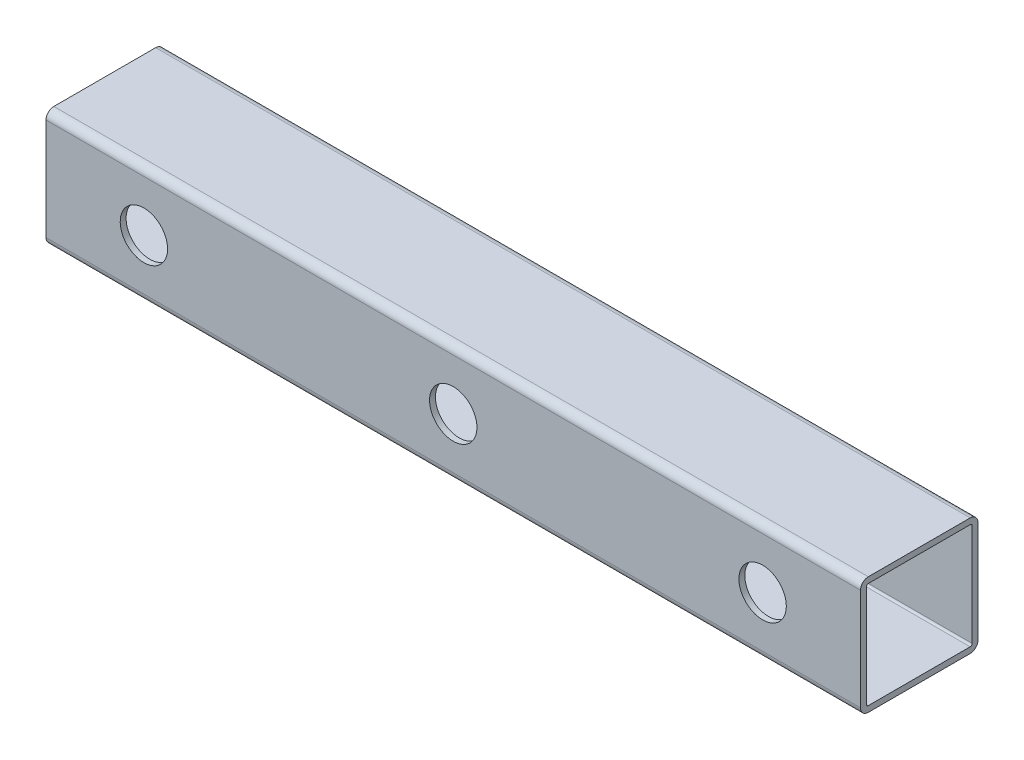
ISO-10303-21;
HEADER;
FILE_DESCRIPTION(('STEP AP214'),'2;1');
FILE_NAME('part.step','',(''),(''),'','','');
FILE_SCHEMA(('AUTOMOTIVE_DESIGN { 1 0 10303 214 1 1 1 1 }'));
ENDSEC;
DATA;
#1=APPLICATION_CONTEXT('core data for automotive mechanical design processes');
#2=APPLICATION_PROTOCOL_DEFINITION('international standard','automotive_design',2000,#1);
#3=PRODUCT_CONTEXT('',#1,'mechanical');
#4=PRODUCT('Part','Part','',(#3));
#5=PRODUCT_RELATED_PRODUCT_CATEGORY('part','',(#4));
#6=PRODUCT_DEFINITION_FORMATION('','',#4);
#7=PRODUCT_DEFINITION_CONTEXT('part definition',#1,'design');
#8=PRODUCT_DEFINITION('design','',#6,#7);
#9=PRODUCT_DEFINITION_SHAPE('','',#8);
#10=(LENGTH_UNIT() NAMED_UNIT(*) SI_UNIT(.MILLI.,.METRE.));
#11=(NAMED_UNIT(*) PLANE_ANGLE_UNIT() SI_UNIT($,.RADIAN.));
#12=(NAMED_UNIT(*) SI_UNIT($,.STERADIAN.) SOLID_ANGLE_UNIT());
#13=UNCERTAINTY_MEASURE_WITH_UNIT(LENGTH_MEASURE(1.E-05),#10,'distance_accuracy_value','');
#14=(GEOMETRIC_REPRESENTATION_CONTEXT(3) GLOBAL_UNCERTAINTY_ASSIGNED_CONTEXT((#13)) GLOBAL_UNIT_ASSIGNED_CONTEXT((#10,
#11,#12)) REPRESENTATION_CONTEXT('',''));
#15=CARTESIAN_POINT('',(0.,0.,0.));
#16=DIRECTION('',(0.,0.,1.));
#17=DIRECTION('',(1.,0.,0.));
#18=AXIS2_PLACEMENT_3D('',#15,#16,#17);
#19=CARTESIAN_POINT('',(208.,-30.,26.));
#20=DIRECTION('',(0.,1.,0.));
#21=DIRECTION('',(0.,0.,1.));
#22=AXIS2_PLACEMENT_3D('',#19,#20,#21);
#23=PLANE('',#22);
#24=DIRECTION('',(0.,0.,1.));
#25=VECTOR('',#24,1.);
#26=CARTESIAN_POINT('',(152.,-30.,26.));
#27=LINE('',#26,#25);
#28=CARTESIAN_POINT('',(152.,-30.,-26.));
#29=VERTEX_POINT('',#28);
#30=CARTESIAN_POINT('',(152.,-30.,26.));
#31=VERTEX_POINT('',#30);
#32=EDGE_CURVE('E11',#29,#31,#27,.T.);
#33=ORIENTED_EDGE('',*,*,#32,.F.);
#34=DIRECTION('',(-1.,0.,0.));
#35=VECTOR('',#34,1.);
#36=CARTESIAN_POINT('',(208.,-30.,-26.));
#37=LINE('',#36,#35);
#38=CARTESIAN_POINT('',(208.,-30.,-26.));
#39=VERTEX_POINT('',#38);
#40=EDGE_CURVE('E298',#39,#29,#37,.T.);
#41=ORIENTED_EDGE('',*,*,#40,.F.);
#42=DIRECTION('',(0.,0.,-1.));
#43=VECTOR('',#42,1.);
#44=CARTESIAN_POINT('',(208.,-30.,26.));
#45=LINE('',#44,#43);
#46=CARTESIAN_POINT('',(208.,-30.,26.));
#47=VERTEX_POINT('',#46);
#48=EDGE_CURVE('E248',#47,#39,#45,.T.);
#49=ORIENTED_EDGE('',*,*,#48,.F.);
#50=DIRECTION('',(-1.,0.,0.));
#51=VECTOR('',#50,1.);
#52=CARTESIAN_POINT('',(208.,-30.,26.));
#53=LINE('',#52,#51);
#54=EDGE_CURVE('E303',#47,#31,#53,.T.);
#55=ORIENTED_EDGE('',*,*,#54,.T.);
#56=EDGE_LOOP('',(#33,#41,#49,#55));
#57=FACE_BOUND('',#56,.T.);
#58=ADVANCED_FACE('F45',(#57),#23,.F.);
#59=DIRECTION('',(0.,0.,-1.));
#60=VECTOR('',#59,1.);
#61=CARTESIAN_POINT('',(-152.,-30.,26.));
#62=LINE('',#61,#60);
#63=CARTESIAN_POINT('',(-152.,-30.,26.));
#64=VERTEX_POINT('',#63);
#65=CARTESIAN_POINT('',(-152.,-30.,-26.));
#66=VERTEX_POINT('',#65);
#67=EDGE_CURVE('E55',#64,#66,#62,.T.);
#68=ORIENTED_EDGE('',*,*,#67,.F.);
#69=CARTESIAN_POINT('',(-208.,-30.,26.));
#70=VERTEX_POINT('',#69);
#71=EDGE_CURVE('E301',#64,#70,#53,.T.);
#72=ORIENTED_EDGE('',*,*,#71,.T.);
#73=DIRECTION('',(0.,0.,-1.));
#74=VECTOR('',#73,1.);
#75=CARTESIAN_POINT('',(-208.,-30.,26.));
#76=LINE('',#75,#74);
#77=CARTESIAN_POINT('',(-208.,-30.,-26.));
#78=VERTEX_POINT('',#77);
#79=EDGE_CURVE('E266',#70,#78,#76,.T.);
#80=ORIENTED_EDGE('',*,*,#79,.T.);
#81=EDGE_CURVE('E297',#66,#78,#37,.T.);
#82=ORIENTED_EDGE('',*,*,#81,.F.);
#83=EDGE_LOOP('',(#68,#72,#80,#82));
#84=FACE_BOUND('',#83,.T.);
#85=ADVANCED_FACE('F376',(#84),#23,.F.);
#86=CARTESIAN_POINT('',(208.,-26.,26.));
#87=DIRECTION('',(-1.,0.,0.));
#88=DIRECTION('',(0.,0.,1.));
#89=AXIS2_PLACEMENT_3D('',#86,#87,#88);
#90=PLANE('',#89);
#91=CARTESIAN_POINT('',(208.,-26.,26.));
#92=DIRECTION('',(1.,0.,0.));
#93=DIRECTION('',(0.,0.,1.));
#94=AXIS2_PLACEMENT_3D('',#91,#92,#93);
#95=CIRCLE('',#94,4.);
#96=CARTESIAN_POINT('',(208.,-26.,30.));
#97=VERTEX_POINT('',#96);
#98=EDGE_CURVE('E245',#97,#47,#95,.T.);
#99=ORIENTED_EDGE('',*,*,#98,.T.);
#100=ORIENTED_EDGE('',*,*,#48,.T.);
#101=CARTESIAN_POINT('',(208.,-26.,-26.));
#102=DIRECTION('',(1.,0.,0.));
#103=DIRECTION('',(0.,0.,-1.));
#104=AXIS2_PLACEMENT_3D('',#101,#102,#103);
#105=CIRCLE('',#104,4.00000000000001);
#106=CARTESIAN_POINT('',(208.,-26.,-30.));
#107=VERTEX_POINT('',#106);
#108=EDGE_CURVE('E251',#39,#107,#105,.T.);
#109=ORIENTED_EDGE('',*,*,#108,.T.);
#110=DIRECTION('',(0.,1.,0.));
#111=VECTOR('',#110,1.);
#112=CARTESIAN_POINT('',(208.,-26.,-30.));
#113=LINE('',#112,#111);
#114=CARTESIAN_POINT('',(208.,26.,-30.));
#115=VERTEX_POINT('',#114);
#116=EDGE_CURVE('E253',#107,#115,#113,.T.);
#117=ORIENTED_EDGE('',*,*,#116,.T.);
#118=CARTESIAN_POINT('',(208.,26.,-26.));
#119=DIRECTION('',(1.,0.,0.));
#120=DIRECTION('',(0.,0.,1.));
#121=AXIS2_PLACEMENT_3D('',#118,#119,#120);
#122=CIRCLE('',#121,4.);
#123=CARTESIAN_POINT('',(208.,30.,-26.));
#124=VERTEX_POINT('',#123);
#125=EDGE_CURVE('E255',#115,#124,#122,.T.);
#126=ORIENTED_EDGE('',*,*,#125,.T.);
#127=DIRECTION('',(0.,0.,1.));
#128=VECTOR('',#127,1.);
#129=CARTESIAN_POINT('',(208.,30.,26.));
#130=LINE('',#129,#128);
#131=CARTESIAN_POINT('',(208.,30.,26.));
#132=VERTEX_POINT('',#131);
#133=EDGE_CURVE('E257',#124,#132,#130,.T.);
#134=ORIENTED_EDGE('',*,*,#133,.T.);
#135=CARTESIAN_POINT('',(208.,26.,26.));
#136=DIRECTION('',(1.,0.,0.));
#137=DIRECTION('',(0.,0.,1.));
#138=AXIS2_PLACEMENT_3D('',#135,#136,#137);
#139=CIRCLE('',#138,4.);
#140=CARTESIAN_POINT('',(208.,26.,30.));
#141=VERTEX_POINT('',#140);
#142=EDGE_CURVE('E259',#132,#141,#139,.T.);
#143=ORIENTED_EDGE('',*,*,#142,.T.);
#144=DIRECTION('',(0.,-1.,0.));
#145=VECTOR('',#144,1.);
#146=CARTESIAN_POINT('',(208.,-26.,30.));
#147=LINE('',#146,#145);
#148=EDGE_CURVE('E261',#141,#97,#147,.T.);
#149=ORIENTED_EDGE('',*,*,#148,.T.);
#150=EDGE_LOOP('',(#99,#100,#109,#117,#126,#134,#143,#149));
#151=FACE_BOUND('',#150,.T.);
#152=CARTESIAN_POINT('',(208.,26.,26.));
#153=DIRECTION('',(1.,0.,0.));
#154=DIRECTION('',(0.,0.,1.));
#155=AXIS2_PLACEMENT_3D('',#152,#153,#154);
#156=CIRCLE('',#155,1.);
#157=CARTESIAN_POINT('',(208.,27.,26.));
#158=VERTEX_POINT('',#157);
#159=CARTESIAN_POINT('',(208.,26.,27.));
#160=VERTEX_POINT('',#159);
#161=EDGE_CURVE('E172',#158,#160,#156,.T.);
#162=ORIENTED_EDGE('',*,*,#161,.F.);
#163=DIRECTION('',(0.,0.,1.));
#164=VECTOR('',#163,1.);
#165=CARTESIAN_POINT('',(208.,27.,26.));
#166=LINE('',#165,#164);
#167=CARTESIAN_POINT('',(208.,27.,-26.));
#168=VERTEX_POINT('',#167);
#169=EDGE_CURVE('E210',#168,#158,#166,.T.);
#170=ORIENTED_EDGE('',*,*,#169,.F.);
#171=CARTESIAN_POINT('',(208.,26.,-26.));
#172=DIRECTION('',(1.,0.,0.));
#173=DIRECTION('',(0.,0.,1.));
#174=AXIS2_PLACEMENT_3D('',#171,#172,#173);
#175=CIRCLE('',#174,1.);
#176=CARTESIAN_POINT('',(208.,26.,-27.));
#177=VERTEX_POINT('',#176);
#178=EDGE_CURVE('E207',#177,#168,#175,.T.);
#179=ORIENTED_EDGE('',*,*,#178,.F.);
#180=DIRECTION('',(0.,1.,0.));
#181=VECTOR('',#180,1.);
#182=CARTESIAN_POINT('',(208.,-26.,-27.));
#183=LINE('',#182,#181);
#184=CARTESIAN_POINT('',(208.,-26.,-27.));
#185=VERTEX_POINT('',#184);
#186=EDGE_CURVE('E205',#185,#177,#183,.T.);
#187=ORIENTED_EDGE('',*,*,#186,.F.);
#188=CARTESIAN_POINT('',(208.,-26.,-26.));
#189=DIRECTION('',(1.,0.,0.));
#190=DIRECTION('',(0.,0.,-1.));
#191=AXIS2_PLACEMENT_3D('',#188,#189,#190);
#192=CIRCLE('',#191,1.00000000000001);
#193=CARTESIAN_POINT('',(208.,-27.,-26.));
#194=VERTEX_POINT('',#193);
#195=EDGE_CURVE('E203',#194,#185,#192,.T.);
#196=ORIENTED_EDGE('',*,*,#195,.F.);
#197=DIRECTION('',(0.,0.,-1.));
#198=VECTOR('',#197,1.);
#199=CARTESIAN_POINT('',(208.,-27.,26.));
#200=LINE('',#199,#198);
#201=CARTESIAN_POINT('',(208.,-27.,26.));
#202=VERTEX_POINT('',#201);
#203=EDGE_CURVE('E198',#202,#194,#200,.T.);
#204=ORIENTED_EDGE('',*,*,#203,.F.);
#205=CARTESIAN_POINT('',(208.,-26.,26.));
#206=DIRECTION('',(1.,0.,0.));
#207=DIRECTION('',(0.,0.,1.));
#208=AXIS2_PLACEMENT_3D('',#205,#206,#207);
#209=CIRCLE('',#208,1.);
#210=CARTESIAN_POINT('',(208.,-26.,27.));
#211=VERTEX_POINT('',#210);
#212=EDGE_CURVE('E196',#211,#202,#209,.T.);
#213=ORIENTED_EDGE('',*,*,#212,.F.);
#214=DIRECTION('',(0.,-1.,0.));
#215=VECTOR('',#214,1.);
#216=CARTESIAN_POINT('',(208.,-26.,27.));
#217=LINE('',#216,#215);
#218=EDGE_CURVE('E182',#160,#211,#217,.T.);
#219=ORIENTED_EDGE('',*,*,#218,.F.);
#220=EDGE_LOOP('',(#162,#170,#179,#187,#196,#204,#213,#219));
#221=FACE_BOUND('',#220,.T.);
#222=ADVANCED_FACE('F194',(#151,#221),#90,.F.);
#223=CARTESIAN_POINT('',(-208.,-26.,26.));
#224=DIRECTION('',(-1.,0.,0.));
#225=DIRECTION('',(0.,0.,1.));
#226=AXIS2_PLACEMENT_3D('',#223,#224,#225);
#227=PLANE('',#226);
#228=CARTESIAN_POINT('',(-208.,-26.,26.));
#229=DIRECTION('',(1.,0.,0.));
#230=DIRECTION('',(0.,0.,1.));
#231=AXIS2_PLACEMENT_3D('',#228,#229,#230);
#232=CIRCLE('',#231,4.);
#233=CARTESIAN_POINT('',(-208.,-26.,30.));
#234=VERTEX_POINT('',#233);
#235=EDGE_CURVE('E190',#234,#70,#232,.T.);
#236=ORIENTED_EDGE('',*,*,#235,.F.);
#237=DIRECTION('',(0.,-1.,0.));
#238=VECTOR('',#237,1.);
#239=CARTESIAN_POINT('',(-208.,-26.,30.));
#240=LINE('',#239,#238);
#241=CARTESIAN_POINT('',(-208.,26.,30.));
#242=VERTEX_POINT('',#241);
#243=EDGE_CURVE('E249',#242,#234,#240,.T.);
#244=ORIENTED_EDGE('',*,*,#243,.F.);
#245=CARTESIAN_POINT('',(-208.,26.,26.));
#246=DIRECTION('',(1.,0.,0.));
#247=DIRECTION('',(0.,0.,1.));
#248=AXIS2_PLACEMENT_3D('',#245,#246,#247);
#249=CIRCLE('',#248,4.);
#250=CARTESIAN_POINT('',(-208.,30.,26.));
#251=VERTEX_POINT('',#250);
#252=EDGE_CURVE('E277',#251,#242,#249,.T.);
#253=ORIENTED_EDGE('',*,*,#252,.F.);
#254=DIRECTION('',(0.,0.,1.));
#255=VECTOR('',#254,1.);
#256=CARTESIAN_POINT('',(-208.,30.,26.));
#257=LINE('',#256,#255);
#258=CARTESIAN_POINT('',(-208.,30.,-26.));
#259=VERTEX_POINT('',#258);
#260=EDGE_CURVE('E275',#259,#251,#257,.T.);
#261=ORIENTED_EDGE('',*,*,#260,.F.);
#262=CARTESIAN_POINT('',(-208.,26.,-26.));
#263=DIRECTION('',(1.,0.,0.));
#264=DIRECTION('',(0.,0.,1.));
#265=AXIS2_PLACEMENT_3D('',#262,#263,#264);
#266=CIRCLE('',#265,4.);
#267=CARTESIAN_POINT('',(-208.,26.,-30.));
#268=VERTEX_POINT('',#267);
#269=EDGE_CURVE('E273',#268,#259,#266,.T.);
#270=ORIENTED_EDGE('',*,*,#269,.F.);
#271=DIRECTION('',(0.,1.,0.));
#272=VECTOR('',#271,1.);
#273=CARTESIAN_POINT('',(-208.,-26.,-30.));
#274=LINE('',#273,#272);
#275=CARTESIAN_POINT('',(-208.,-26.,-30.));
#276=VERTEX_POINT('',#275);
#277=EDGE_CURVE('E271',#276,#268,#274,.T.);
#278=ORIENTED_EDGE('',*,*,#277,.F.);
#279=CARTESIAN_POINT('',(-208.,-26.,-26.));
#280=DIRECTION('',(1.,0.,0.));
#281=DIRECTION('',(0.,0.,-1.));
#282=AXIS2_PLACEMENT_3D('',#279,#280,#281);
#283=CIRCLE('',#282,4.00000000000001);
#284=EDGE_CURVE('E269',#78,#276,#283,.T.);
#285=ORIENTED_EDGE('',*,*,#284,.F.);
#286=ORIENTED_EDGE('',*,*,#79,.F.);
#287=EDGE_LOOP('',(#236,#244,#253,#261,#270,#278,#285,#286));
#288=FACE_BOUND('',#287,.T.);
#289=DIRECTION('',(0.,0.,1.));
#290=VECTOR('',#289,1.);
#291=CARTESIAN_POINT('',(-208.,27.,26.));
#292=LINE('',#291,#290);
#293=CARTESIAN_POINT('',(-208.,27.,-26.));
#294=VERTEX_POINT('',#293);
#295=CARTESIAN_POINT('',(-208.,27.,26.));
#296=VERTEX_POINT('',#295);
#297=EDGE_CURVE('E183',#294,#296,#292,.T.);
#298=ORIENTED_EDGE('',*,*,#297,.T.);
#299=CARTESIAN_POINT('',(-208.,26.,26.));
#300=DIRECTION('',(1.,0.,0.));
#301=DIRECTION('',(0.,0.,1.));
#302=AXIS2_PLACEMENT_3D('',#299,#300,#301);
#303=CIRCLE('',#302,1.);
#304=CARTESIAN_POINT('',(-208.,26.,27.));
#305=VERTEX_POINT('',#304);
#306=EDGE_CURVE('E212',#296,#305,#303,.T.);
#307=ORIENTED_EDGE('',*,*,#306,.T.);
#308=DIRECTION('',(0.,-1.,0.));
#309=VECTOR('',#308,1.);
#310=CARTESIAN_POINT('',(-208.,-26.,27.));
#311=LINE('',#310,#309);
#312=CARTESIAN_POINT('',(-208.,-26.,27.));
#313=VERTEX_POINT('',#312);
#314=EDGE_CURVE('E189',#305,#313,#311,.T.);
#315=ORIENTED_EDGE('',*,*,#314,.T.);
#316=CARTESIAN_POINT('',(-208.,-26.,26.));
#317=DIRECTION('',(1.,0.,0.));
#318=DIRECTION('',(0.,0.,1.));
#319=AXIS2_PLACEMENT_3D('',#316,#317,#318);
#320=CIRCLE('',#319,1.);
#321=CARTESIAN_POINT('',(-208.,-27.,26.));
#322=VERTEX_POINT('',#321);
#323=EDGE_CURVE('E216',#313,#322,#320,.T.);
#324=ORIENTED_EDGE('',*,*,#323,.T.);
#325=DIRECTION('',(0.,0.,-1.));
#326=VECTOR('',#325,1.);
#327=CARTESIAN_POINT('',(-208.,-27.,26.));
#328=LINE('',#327,#326);
#329=CARTESIAN_POINT('',(-208.,-27.,-26.));
#330=VERTEX_POINT('',#329);
#331=EDGE_CURVE('E219',#322,#330,#328,.T.);
#332=ORIENTED_EDGE('',*,*,#331,.T.);
#333=CARTESIAN_POINT('',(-208.,-26.,-26.));
#334=DIRECTION('',(1.,0.,0.));
#335=DIRECTION('',(0.,0.,-1.));
#336=AXIS2_PLACEMENT_3D('',#333,#334,#335);
#337=CIRCLE('',#336,1.00000000000001);
#338=CARTESIAN_POINT('',(-208.,-26.,-27.));
#339=VERTEX_POINT('',#338);
#340=EDGE_CURVE('E222',#330,#339,#337,.T.);
#341=ORIENTED_EDGE('',*,*,#340,.T.);
#342=DIRECTION('',(0.,1.,0.));
#343=VECTOR('',#342,1.);
#344=CARTESIAN_POINT('',(-208.,-26.,-27.));
#345=LINE('',#344,#343);
#346=CARTESIAN_POINT('',(-208.,26.,-27.));
#347=VERTEX_POINT('',#346);
#348=EDGE_CURVE('E225',#339,#347,#345,.T.);
#349=ORIENTED_EDGE('',*,*,#348,.T.);
#350=CARTESIAN_POINT('',(-208.,26.,-26.));
#351=DIRECTION('',(1.,0.,0.));
#352=DIRECTION('',(0.,0.,1.));
#353=AXIS2_PLACEMENT_3D('',#350,#351,#352);
#354=CIRCLE('',#353,1.);
#355=EDGE_CURVE('E228',#347,#294,#354,.T.);
#356=ORIENTED_EDGE('',*,*,#355,.T.);
#357=EDGE_LOOP('',(#298,#307,#315,#324,#332,#341,#349,#356));
#358=FACE_BOUND('',#357,.T.);
#359=ADVANCED_FACE('F352',(#288,#358),#227,.T.);
#360=CARTESIAN_POINT('',(208.,-26.,26.));
#361=DIRECTION('',(-1.,0.,0.));
#362=DIRECTION('',(0.,0.,1.));
#363=AXIS2_PLACEMENT_3D('',#360,#361,#362);
#364=CYLINDRICAL_SURFACE('',#363,4.);
#365=ORIENTED_EDGE('',*,*,#235,.T.);
#366=ORIENTED_EDGE('',*,*,#71,.F.);
#367=EDGE_CURVE('E306',#31,#64,#53,.T.);
#368=ORIENTED_EDGE('',*,*,#367,.F.);
#369=ORIENTED_EDGE('',*,*,#54,.F.);
#370=ORIENTED_EDGE('',*,*,#98,.F.);
#371=DIRECTION('',(-1.,0.,0.));
#372=VECTOR('',#371,1.);
#373=CARTESIAN_POINT('',(208.,-26.,30.));
#374=LINE('',#373,#372);
#375=EDGE_CURVE('E263',#97,#234,#374,.T.);
#376=ORIENTED_EDGE('',*,*,#375,.T.);
#377=EDGE_LOOP('',(#365,#366,#368,#369,#370,#376));
#378=FACE_BOUND('',#377,.T.);
#379=ADVANCED_FACE('F47',(#378),#364,.T.);
#380=EDGE_CURVE('E302',#29,#66,#37,.T.);
#381=ORIENTED_EDGE('',*,*,#380,.F.);
#382=ORIENTED_EDGE('',*,*,#32,.T.);
#383=ORIENTED_EDGE('',*,*,#367,.T.);
#384=ORIENTED_EDGE('',*,*,#67,.T.);
#385=EDGE_LOOP('',(#381,#382,#383,#384));
#386=FACE_BOUND('',#385,.T.);
#387=ADVANCED_FACE('F378',(#386),#23,.F.);
#388=CARTESIAN_POINT('',(208.,-26.,-26.));
#389=DIRECTION('',(-1.,0.,0.));
#390=DIRECTION('',(0.,0.,1.));
#391=AXIS2_PLACEMENT_3D('',#388,#389,#390);
#392=CYLINDRICAL_SURFACE('',#391,4.00000000000001);
#393=ORIENTED_EDGE('',*,*,#284,.T.);
#394=DIRECTION('',(-1.,0.,0.));
#395=VECTOR('',#394,1.);
#396=CARTESIAN_POINT('',(208.,-26.,-30.));
#397=LINE('',#396,#395);
#398=EDGE_CURVE('E294',#107,#276,#397,.T.);
#399=ORIENTED_EDGE('',*,*,#398,.F.);
#400=ORIENTED_EDGE('',*,*,#108,.F.);
#401=ORIENTED_EDGE('',*,*,#40,.T.);
#402=ORIENTED_EDGE('',*,*,#380,.T.);
#403=ORIENTED_EDGE('',*,*,#81,.T.);
#404=EDGE_LOOP('',(#393,#399,#400,#401,#402,#403));
#405=FACE_BOUND('',#404,.T.);
#406=ADVANCED_FACE('F384',(#405),#392,.T.);
#407=CARTESIAN_POINT('',(208.,-26.,-30.));
#408=DIRECTION('',(0.,0.,1.));
#409=DIRECTION('',(1.,0.,0.));
#410=AXIS2_PLACEMENT_3D('',#407,#408,#409);
#411=PLANE('',#410);
#412=CARTESIAN_POINT('',(158.,0.,-30.));
#413=DIRECTION('',(0.,0.,-1.));
#414=DIRECTION('',(0.,1.,0.));
#415=AXIS2_PLACEMENT_3D('',#412,#413,#414);
#416=CIRCLE('',#415,12.1);
#417=CARTESIAN_POINT('',(158.,12.1,-30.));
#418=VERTEX_POINT('',#417);
#419=EDGE_CURVE('E452',#418,#418,#416,.T.);
#420=ORIENTED_EDGE('',*,*,#419,.F.);
#421=EDGE_LOOP('',(#420));
#422=FACE_BOUND('',#421,.T.);
#423=CARTESIAN_POINT('',(-158.,0.,-30.));
#424=DIRECTION('',(0.,0.,-1.));
#425=DIRECTION('',(0.,-1.,0.));
#426=AXIS2_PLACEMENT_3D('',#423,#424,#425);
#427=CIRCLE('',#426,12.1);
#428=CARTESIAN_POINT('',(-158.,-12.1,-30.));
#429=VERTEX_POINT('',#428);
#430=EDGE_CURVE('E456',#429,#429,#427,.T.);
#431=ORIENTED_EDGE('',*,*,#430,.F.);
#432=EDGE_LOOP('',(#431));
#433=FACE_BOUND('',#432,.T.);
#434=CARTESIAN_POINT('',(0.,0.,-30.));
#435=DIRECTION('',(0.,0.,-1.));
#436=DIRECTION('',(0.,1.,0.));
#437=AXIS2_PLACEMENT_3D('',#434,#435,#436);
#438=CIRCLE('',#437,12.1);
#439=CARTESIAN_POINT('',(0.,12.1,-30.));
#440=VERTEX_POINT('',#439);
#441=EDGE_CURVE('E325',#440,#440,#438,.T.);
#442=ORIENTED_EDGE('',*,*,#441,.F.);
#443=EDGE_LOOP('',(#442));
#444=FACE_BOUND('',#443,.T.);
#445=ORIENTED_EDGE('',*,*,#277,.T.);
#446=DIRECTION('',(-1.,0.,0.));
#447=VECTOR('',#446,1.);
#448=CARTESIAN_POINT('',(208.,26.,-30.));
#449=LINE('',#448,#447);
#450=EDGE_CURVE('E291',#115,#268,#449,.T.);
#451=ORIENTED_EDGE('',*,*,#450,.F.);
#452=ORIENTED_EDGE('',*,*,#116,.F.);
#453=ORIENTED_EDGE('',*,*,#398,.T.);
#454=EDGE_LOOP('',(#445,#451,#452,#453));
#455=FACE_BOUND('',#454,.T.);
#456=ADVANCED_FACE('F389',(#422,#433,#444,#455),#411,.F.);
#457=CARTESIAN_POINT('',(208.,26.,-26.));
#458=DIRECTION('',(-1.,0.,0.));
#459=DIRECTION('',(0.,0.,1.));
#460=AXIS2_PLACEMENT_3D('',#457,#458,#459);
#461=CYLINDRICAL_SURFACE('',#460,4.);
#462=ORIENTED_EDGE('',*,*,#269,.T.);
#463=DIRECTION('',(-1.,0.,0.));
#464=VECTOR('',#463,1.);
#465=CARTESIAN_POINT('',(208.,30.,-26.));
#466=LINE('',#465,#464);
#467=EDGE_CURVE('E288',#124,#259,#466,.T.);
#468=ORIENTED_EDGE('',*,*,#467,.F.);
#469=ORIENTED_EDGE('',*,*,#125,.F.);
#470=ORIENTED_EDGE('',*,*,#450,.T.);
#471=EDGE_LOOP('',(#462,#468,#469,#470));
#472=FACE_BOUND('',#471,.T.);
#473=ADVANCED_FACE('F422',(#472),#461,.T.);
#474=CARTESIAN_POINT('',(208.,30.,26.));
#475=DIRECTION('',(0.,-1.,0.));
#476=DIRECTION('',(0.,0.,-1.));
#477=AXIS2_PLACEMENT_3D('',#474,#475,#476);
#478=PLANE('',#477);
#479=ORIENTED_EDGE('',*,*,#260,.T.);
#480=DIRECTION('',(-1.,0.,0.));
#481=VECTOR('',#480,1.);
#482=CARTESIAN_POINT('',(208.,30.,26.));
#483=LINE('',#482,#481);
#484=EDGE_CURVE('E285',#132,#251,#483,.T.);
#485=ORIENTED_EDGE('',*,*,#484,.F.);
#486=ORIENTED_EDGE('',*,*,#133,.F.);
#487=ORIENTED_EDGE('',*,*,#467,.T.);
#488=EDGE_LOOP('',(#479,#485,#486,#487));
#489=FACE_BOUND('',#488,.T.);
#490=ADVANCED_FACE('F418',(#489),#478,.F.);
#491=CARTESIAN_POINT('',(208.,26.,26.));
#492=DIRECTION('',(-1.,0.,0.));
#493=DIRECTION('',(0.,0.,1.));
#494=AXIS2_PLACEMENT_3D('',#491,#492,#493);
#495=CYLINDRICAL_SURFACE('',#494,4.);
#496=ORIENTED_EDGE('',*,*,#252,.T.);
#497=DIRECTION('',(-1.,0.,0.));
#498=VECTOR('',#497,1.);
#499=CARTESIAN_POINT('',(208.,26.,30.));
#500=LINE('',#499,#498);
#501=EDGE_CURVE('E282',#141,#242,#500,.T.);
#502=ORIENTED_EDGE('',*,*,#501,.F.);
#503=ORIENTED_EDGE('',*,*,#142,.F.);
#504=ORIENTED_EDGE('',*,*,#484,.T.);
#505=EDGE_LOOP('',(#496,#502,#503,#504));
#506=FACE_BOUND('',#505,.T.);
#507=ADVANCED_FACE('F413',(#506),#495,.T.);
#508=CARTESIAN_POINT('',(208.,-26.,30.));
#509=DIRECTION('',(0.,0.,-1.));
#510=DIRECTION('',(-1.,0.,0.));
#511=AXIS2_PLACEMENT_3D('',#508,#509,#510);
#512=PLANE('',#511);
#513=CARTESIAN_POINT('',(158.,0.,30.));
#514=DIRECTION('',(0.,0.,-1.));
#515=DIRECTION('',(-1.,0.,0.));
#516=AXIS2_PLACEMENT_3D('',#513,#514,#515);
#517=CIRCLE('',#516,12.1);
#518=CARTESIAN_POINT('',(158.,12.1,30.));
#519=VERTEX_POINT('',#518);
#520=EDGE_CURVE('E312',#519,#519,#517,.F.);
#521=ORIENTED_EDGE('',*,*,#520,.F.);
#522=EDGE_LOOP('',(#521));
#523=FACE_BOUND('',#522,.T.);
#524=CARTESIAN_POINT('',(-158.,0.,30.));
#525=DIRECTION('',(0.,0.,-1.));
#526=DIRECTION('',(-1.,0.,0.));
#527=AXIS2_PLACEMENT_3D('',#524,#525,#526);
#528=CIRCLE('',#527,12.1);
#529=CARTESIAN_POINT('',(-158.,12.1,30.));
#530=VERTEX_POINT('',#529);
#531=EDGE_CURVE('E460',#530,#530,#528,.F.);
#532=ORIENTED_EDGE('',*,*,#531,.F.);
#533=EDGE_LOOP('',(#532));
#534=FACE_BOUND('',#533,.T.);
#535=CARTESIAN_POINT('',(0.,0.,30.));
#536=DIRECTION('',(0.,0.,-1.));
#537=DIRECTION('',(-1.,0.,0.));
#538=AXIS2_PLACEMENT_3D('',#535,#536,#537);
#539=CIRCLE('',#538,12.1);
#540=CARTESIAN_POINT('',(0.,12.1,30.));
#541=VERTEX_POINT('',#540);
#542=EDGE_CURVE('E461',#541,#541,#539,.F.);
#543=ORIENTED_EDGE('',*,*,#542,.F.);
#544=EDGE_LOOP('',(#543));
#545=FACE_BOUND('',#544,.T.);
#546=ORIENTED_EDGE('',*,*,#243,.T.);
#547=ORIENTED_EDGE('',*,*,#375,.F.);
#548=ORIENTED_EDGE('',*,*,#148,.F.);
#549=ORIENTED_EDGE('',*,*,#501,.T.);
#550=EDGE_LOOP('',(#546,#547,#548,#549));
#551=FACE_BOUND('',#550,.T.);
#552=ADVANCED_FACE('F407',(#523,#534,#545,#551),#512,.F.);
#553=CARTESIAN_POINT('',(208.,26.,26.));
#554=DIRECTION('',(-1.,0.,0.));
#555=DIRECTION('',(0.,0.,1.));
#556=AXIS2_PLACEMENT_3D('',#553,#554,#555);
#557=CYLINDRICAL_SURFACE('',#556,1.);
#558=ORIENTED_EDGE('',*,*,#306,.F.);
#559=DIRECTION('',(-1.,0.,0.));
#560=VECTOR('',#559,1.);
#561=CARTESIAN_POINT('',(208.,27.,26.));
#562=LINE('',#561,#560);
#563=EDGE_CURVE('E178',#158,#296,#562,.T.);
#564=ORIENTED_EDGE('',*,*,#563,.F.);
#565=ORIENTED_EDGE('',*,*,#161,.T.);
#566=DIRECTION('',(-1.,0.,0.));
#567=VECTOR('',#566,1.);
#568=CARTESIAN_POINT('',(208.,26.,27.));
#569=LINE('',#568,#567);
#570=EDGE_CURVE('E175',#160,#305,#569,.T.);
#571=ORIENTED_EDGE('',*,*,#570,.T.);
#572=EDGE_LOOP('',(#558,#564,#565,#571));
#573=FACE_BOUND('',#572,.T.);
#574=ADVANCED_FACE('F174',(#573),#557,.F.);
#575=CARTESIAN_POINT('',(208.,-26.,27.));
#576=DIRECTION('',(0.,0.,-1.));
#577=DIRECTION('',(-1.,0.,0.));
#578=AXIS2_PLACEMENT_3D('',#575,#576,#577);
#579=PLANE('',#578);
#580=CARTESIAN_POINT('',(158.,0.,27.));
#581=DIRECTION('',(0.,0.,-1.));
#582=DIRECTION('',(-1.,0.,0.));
#583=AXIS2_PLACEMENT_3D('',#580,#581,#582);
#584=CIRCLE('',#583,12.1);
#585=CARTESIAN_POINT('',(158.,12.1,27.));
#586=VERTEX_POINT('',#585);
#587=EDGE_CURVE('E214',#586,#586,#584,.T.);
#588=ORIENTED_EDGE('',*,*,#587,.F.);
#589=EDGE_LOOP('',(#588));
#590=FACE_BOUND('',#589,.T.);
#591=CARTESIAN_POINT('',(-158.,0.,27.));
#592=DIRECTION('',(0.,0.,-1.));
#593=DIRECTION('',(-1.,0.,0.));
#594=AXIS2_PLACEMENT_3D('',#591,#592,#593);
#595=CIRCLE('',#594,12.1);
#596=CARTESIAN_POINT('',(-158.,12.1,27.));
#597=VERTEX_POINT('',#596);
#598=EDGE_CURVE('E315',#597,#597,#595,.T.);
#599=ORIENTED_EDGE('',*,*,#598,.F.);
#600=EDGE_LOOP('',(#599));
#601=FACE_BOUND('',#600,.T.);
#602=CARTESIAN_POINT('',(0.,0.,27.));
#603=DIRECTION('',(0.,0.,-1.));
#604=DIRECTION('',(-1.,0.,0.));
#605=AXIS2_PLACEMENT_3D('',#602,#603,#604);
#606=CIRCLE('',#605,12.1);
#607=CARTESIAN_POINT('',(0.,12.1,27.));
#608=VERTEX_POINT('',#607);
#609=EDGE_CURVE('E311',#608,#608,#606,.T.);
#610=ORIENTED_EDGE('',*,*,#609,.F.);
#611=EDGE_LOOP('',(#610));
#612=FACE_BOUND('',#611,.T.);
#613=ORIENTED_EDGE('',*,*,#314,.F.);
#614=ORIENTED_EDGE('',*,*,#570,.F.);
#615=ORIENTED_EDGE('',*,*,#218,.T.);
#616=DIRECTION('',(-1.,0.,0.));
#617=VECTOR('',#616,1.);
#618=CARTESIAN_POINT('',(208.,-26.,27.));
#619=LINE('',#618,#617);
#620=EDGE_CURVE('E191',#211,#313,#619,.T.);
#621=ORIENTED_EDGE('',*,*,#620,.T.);
#622=EDGE_LOOP('',(#613,#614,#615,#621));
#623=FACE_BOUND('',#622,.T.);
#624=ADVANCED_FACE('F186',(#590,#601,#612,#623),#579,.T.);
#625=CARTESIAN_POINT('',(208.,-26.,26.));
#626=DIRECTION('',(-1.,0.,0.));
#627=DIRECTION('',(0.,0.,1.));
#628=AXIS2_PLACEMENT_3D('',#625,#626,#627);
#629=CYLINDRICAL_SURFACE('',#628,1.);
#630=ORIENTED_EDGE('',*,*,#323,.F.);
#631=ORIENTED_EDGE('',*,*,#620,.F.);
#632=ORIENTED_EDGE('',*,*,#212,.T.);
#633=DIRECTION('',(-1.,0.,0.));
#634=VECTOR('',#633,1.);
#635=CARTESIAN_POINT('',(208.,-27.,26.));
#636=LINE('',#635,#634);
#637=EDGE_CURVE('E242',#202,#322,#636,.T.);
#638=ORIENTED_EDGE('',*,*,#637,.T.);
#639=EDGE_LOOP('',(#630,#631,#632,#638));
#640=FACE_BOUND('',#639,.T.);
#641=ADVANCED_FACE('F497',(#640),#629,.F.);
#642=CARTESIAN_POINT('',(208.,-27.,26.));
#643=DIRECTION('',(0.,1.,0.));
#644=DIRECTION('',(0.,0.,1.));
#645=AXIS2_PLACEMENT_3D('',#642,#643,#644);
#646=PLANE('',#645);
#647=ORIENTED_EDGE('',*,*,#331,.F.);
#648=ORIENTED_EDGE('',*,*,#637,.F.);
#649=ORIENTED_EDGE('',*,*,#203,.T.);
#650=DIRECTION('',(-1.,0.,0.));
#651=VECTOR('',#650,1.);
#652=CARTESIAN_POINT('',(208.,-27.,-26.));
#653=LINE('',#652,#651);
#654=EDGE_CURVE('E240',#194,#330,#653,.T.);
#655=ORIENTED_EDGE('',*,*,#654,.T.);
#656=EDGE_LOOP('',(#647,#648,#649,#655));
#657=FACE_BOUND('',#656,.T.);
#658=ADVANCED_FACE('F502',(#657),#646,.T.);
#659=CARTESIAN_POINT('',(208.,-26.,-26.));
#660=DIRECTION('',(-1.,0.,0.));
#661=DIRECTION('',(0.,0.,1.));
#662=AXIS2_PLACEMENT_3D('',#659,#660,#661);
#663=CYLINDRICAL_SURFACE('',#662,1.00000000000001);
#664=ORIENTED_EDGE('',*,*,#340,.F.);
#665=ORIENTED_EDGE('',*,*,#654,.F.);
#666=ORIENTED_EDGE('',*,*,#195,.T.);
#667=DIRECTION('',(-1.,0.,0.));
#668=VECTOR('',#667,1.);
#669=CARTESIAN_POINT('',(208.,-26.,-27.));
#670=LINE('',#669,#668);
#671=EDGE_CURVE('E238',#185,#339,#670,.T.);
#672=ORIENTED_EDGE('',*,*,#671,.T.);
#673=EDGE_LOOP('',(#664,#665,#666,#672));
#674=FACE_BOUND('',#673,.T.);
#675=ADVANCED_FACE('F340',(#674),#663,.F.);
#676=CARTESIAN_POINT('',(208.,-26.,-27.));
#677=DIRECTION('',(0.,0.,1.));
#678=DIRECTION('',(0.,-1.,0.));
#679=AXIS2_PLACEMENT_3D('',#676,#677,#678);
#680=PLANE('',#679);
#681=CARTESIAN_POINT('',(158.,0.,-27.));
#682=DIRECTION('',(0.,0.,1.));
#683=DIRECTION('',(0.,-1.,0.));
#684=AXIS2_PLACEMENT_3D('',#681,#682,#683);
#685=CIRCLE('',#684,12.1);
#686=CARTESIAN_POINT('',(158.,-12.1,-27.));
#687=VERTEX_POINT('',#686);
#688=EDGE_CURVE('E49',#687,#687,#685,.T.);
#689=ORIENTED_EDGE('',*,*,#688,.F.);
#690=EDGE_LOOP('',(#689));
#691=FACE_BOUND('',#690,.T.);
#692=CARTESIAN_POINT('',(-158.,0.,-27.));
#693=DIRECTION('',(0.,0.,1.));
#694=DIRECTION('',(0.,-1.,0.));
#695=AXIS2_PLACEMENT_3D('',#692,#693,#694);
#696=CIRCLE('',#695,12.1);
#697=CARTESIAN_POINT('',(-158.,-12.1,-27.));
#698=VERTEX_POINT('',#697);
#699=EDGE_CURVE('E313',#698,#698,#696,.T.);
#700=ORIENTED_EDGE('',*,*,#699,.F.);
#701=EDGE_LOOP('',(#700));
#702=FACE_BOUND('',#701,.T.);
#703=CARTESIAN_POINT('',(0.,0.,-27.));
#704=DIRECTION('',(0.,0.,1.));
#705=DIRECTION('',(0.,-1.,0.));
#706=AXIS2_PLACEMENT_3D('',#703,#704,#705);
#707=CIRCLE('',#706,12.1);
#708=CARTESIAN_POINT('',(0.,-12.1,-27.));
#709=VERTEX_POINT('',#708);
#710=EDGE_CURVE('E309',#709,#709,#707,.T.);
#711=ORIENTED_EDGE('',*,*,#710,.F.);
#712=EDGE_LOOP('',(#711));
#713=FACE_BOUND('',#712,.T.);
#714=ORIENTED_EDGE('',*,*,#348,.F.);
#715=ORIENTED_EDGE('',*,*,#671,.F.);
#716=ORIENTED_EDGE('',*,*,#186,.T.);
#717=DIRECTION('',(-1.,0.,0.));
#718=VECTOR('',#717,1.);
#719=CARTESIAN_POINT('',(208.,26.,-27.));
#720=LINE('',#719,#718);
#721=EDGE_CURVE('E236',#177,#347,#720,.T.);
#722=ORIENTED_EDGE('',*,*,#721,.T.);
#723=EDGE_LOOP('',(#714,#715,#716,#722));
#724=FACE_BOUND('',#723,.T.);
#725=ADVANCED_FACE('F336',(#691,#702,#713,#724),#680,.T.);
#726=CARTESIAN_POINT('',(208.,26.,-26.));
#727=DIRECTION('',(-1.,0.,0.));
#728=DIRECTION('',(0.,0.,1.));
#729=AXIS2_PLACEMENT_3D('',#726,#727,#728);
#730=CYLINDRICAL_SURFACE('',#729,1.);
#731=ORIENTED_EDGE('',*,*,#355,.F.);
#732=ORIENTED_EDGE('',*,*,#721,.F.);
#733=ORIENTED_EDGE('',*,*,#178,.T.);
#734=DIRECTION('',(-1.,0.,0.));
#735=VECTOR('',#734,1.);
#736=CARTESIAN_POINT('',(208.,27.,-26.));
#737=LINE('',#736,#735);
#738=EDGE_CURVE('E234',#168,#294,#737,.T.);
#739=ORIENTED_EDGE('',*,*,#738,.T.);
#740=EDGE_LOOP('',(#731,#732,#733,#739));
#741=FACE_BOUND('',#740,.T.);
#742=ADVANCED_FACE('F339',(#741),#730,.F.);
#743=CARTESIAN_POINT('',(208.,27.,26.));
#744=DIRECTION('',(0.,-1.,0.));
#745=DIRECTION('',(0.,0.,-1.));
#746=AXIS2_PLACEMENT_3D('',#743,#744,#745);
#747=PLANE('',#746);
#748=ORIENTED_EDGE('',*,*,#297,.F.);
#749=ORIENTED_EDGE('',*,*,#738,.F.);
#750=ORIENTED_EDGE('',*,*,#169,.T.);
#751=ORIENTED_EDGE('',*,*,#563,.T.);
#752=EDGE_LOOP('',(#748,#749,#750,#751));
#753=FACE_BOUND('',#752,.T.);
#754=ADVANCED_FACE('F361',(#753),#747,.T.);
#755=CARTESIAN_POINT('',(0.,0.,64.2239682094289));
#756=DIRECTION('',(0.,0.,-1.));
#757=DIRECTION('',(0.,1.,0.));
#758=AXIS2_PLACEMENT_3D('',#755,#756,#757);
#759=CYLINDRICAL_SURFACE('',#758,12.1);
#760=ORIENTED_EDGE('',*,*,#710,.T.);
#761=EDGE_LOOP('',(#760));
#762=FACE_BOUND('',#761,.T.);
#763=ORIENTED_EDGE('',*,*,#441,.T.);
#764=EDGE_LOOP('',(#763));
#765=FACE_BOUND('',#764,.T.);
#766=ADVANCED_FACE('F363',(#762,#765),#759,.F.);
#767=CARTESIAN_POINT('',(-158.,0.,64.2239682094289));
#768=DIRECTION('',(0.,0.,-1.));
#769=DIRECTION('',(0.,1.,0.));
#770=AXIS2_PLACEMENT_3D('',#767,#768,#769);
#771=CYLINDRICAL_SURFACE('',#770,12.1);
#772=ORIENTED_EDGE('',*,*,#699,.T.);
#773=EDGE_LOOP('',(#772));
#774=FACE_BOUND('',#773,.T.);
#775=ORIENTED_EDGE('',*,*,#430,.T.);
#776=EDGE_LOOP('',(#775));
#777=FACE_BOUND('',#776,.T.);
#778=ADVANCED_FACE('F370',(#774,#777),#771,.F.);
#779=CARTESIAN_POINT('',(158.,0.,64.2239682094289));
#780=DIRECTION('',(0.,0.,-1.));
#781=DIRECTION('',(0.,1.,0.));
#782=AXIS2_PLACEMENT_3D('',#779,#780,#781);
#783=CYLINDRICAL_SURFACE('',#782,12.1);
#784=ORIENTED_EDGE('',*,*,#688,.T.);
#785=EDGE_LOOP('',(#784));
#786=FACE_BOUND('',#785,.T.);
#787=ORIENTED_EDGE('',*,*,#419,.T.);
#788=EDGE_LOOP('',(#787));
#789=FACE_BOUND('',#788,.T.);
#790=ADVANCED_FACE('F333',(#786,#789),#783,.F.);
#791=CARTESIAN_POINT('',(0.,12.1,27.));
#792=CARTESIAN_POINT('',(0.,12.1,27.03125));
#793=CARTESIAN_POINT('',(0.,12.1,27.0625));
#794=CARTESIAN_POINT('',(0.,12.1,27.125));
#795=CARTESIAN_POINT('',(0.,12.1,27.15625));
#796=CARTESIAN_POINT('',(0.,12.1,27.21875));
#797=CARTESIAN_POINT('',(0.,12.1,27.25));
#798=CARTESIAN_POINT('',(0.,12.1,27.3125));
#799=CARTESIAN_POINT('',(0.,12.1,27.34375));
#800=CARTESIAN_POINT('',(0.,12.1,27.40625));
#801=CARTESIAN_POINT('',(0.,12.1,27.4375));
#802=CARTESIAN_POINT('',(0.,12.1,27.5));
#803=CARTESIAN_POINT('',(0.,12.1,27.53125));
#804=CARTESIAN_POINT('',(0.,12.1,27.59375));
#805=CARTESIAN_POINT('',(0.,12.1,27.625));
#806=CARTESIAN_POINT('',(0.,12.1,27.6875));
#807=CARTESIAN_POINT('',(0.,12.1,27.71875));
#808=CARTESIAN_POINT('',(0.,12.1,27.78125));
#809=CARTESIAN_POINT('',(0.,12.1,27.8125));
#810=CARTESIAN_POINT('',(0.,12.1,27.875));
#811=CARTESIAN_POINT('',(0.,12.1,27.90625));
#812=CARTESIAN_POINT('',(0.,12.1,27.96875));
#813=CARTESIAN_POINT('',(0.,12.1,28.));
#814=CARTESIAN_POINT('',(0.,12.1,28.0625));
#815=CARTESIAN_POINT('',(0.,12.1,28.09375));
#816=CARTESIAN_POINT('',(0.,12.1,28.15625));
#817=CARTESIAN_POINT('',(0.,12.1,28.1875));
#818=CARTESIAN_POINT('',(0.,12.1,28.25));
#819=CARTESIAN_POINT('',(0.,12.1,28.28125));
#820=CARTESIAN_POINT('',(0.,12.1,28.34375));
#821=CARTESIAN_POINT('',(0.,12.1,28.375));
#822=CARTESIAN_POINT('',(0.,12.1,28.4375));
#823=CARTESIAN_POINT('',(0.,12.1,28.46875));
#824=CARTESIAN_POINT('',(0.,12.1,28.53125));
#825=CARTESIAN_POINT('',(0.,12.1,28.5625));
#826=CARTESIAN_POINT('',(0.,12.1,28.625));
#827=CARTESIAN_POINT('',(0.,12.1,28.65625));
#828=CARTESIAN_POINT('',(0.,12.1,28.71875));
#829=CARTESIAN_POINT('',(0.,12.1,28.75));
#830=CARTESIAN_POINT('',(0.,12.1,28.8125));
#831=CARTESIAN_POINT('',(0.,12.1,28.84375));
#832=CARTESIAN_POINT('',(0.,12.1,28.90625));
#833=CARTESIAN_POINT('',(0.,12.1,28.9375));
#834=CARTESIAN_POINT('',(0.,12.1,29.));
#835=CARTESIAN_POINT('',(0.,12.1,29.03125));
#836=CARTESIAN_POINT('',(0.,12.1,29.09375));
#837=CARTESIAN_POINT('',(0.,12.1,29.125));
#838=CARTESIAN_POINT('',(0.,12.1,29.1875));
#839=CARTESIAN_POINT('',(0.,12.1,29.21875));
#840=CARTESIAN_POINT('',(0.,12.1,29.28125));
#841=CARTESIAN_POINT('',(0.,12.1,29.3125));
#842=CARTESIAN_POINT('',(0.,12.1,29.375));
#843=CARTESIAN_POINT('',(0.,12.1,29.40625));
#844=CARTESIAN_POINT('',(0.,12.1,29.46875));
#845=CARTESIAN_POINT('',(0.,12.1,29.5));
#846=CARTESIAN_POINT('',(0.,12.1,29.5625));
#847=CARTESIAN_POINT('',(0.,12.1,29.59375));
#848=CARTESIAN_POINT('',(0.,12.1,29.65625));
#849=CARTESIAN_POINT('',(0.,12.1,29.6875));
#850=CARTESIAN_POINT('',(0.,12.1,29.75));
#851=CARTESIAN_POINT('',(0.,12.1,29.78125));
#852=CARTESIAN_POINT('',(0.,12.1,29.84375));
#853=CARTESIAN_POINT('',(0.,12.1,29.875));
#854=CARTESIAN_POINT('',(0.,12.1,29.9375));
#855=CARTESIAN_POINT('',(0.,12.1,29.96875));
#856=CARTESIAN_POINT('',(0.,12.1,30.));
#857=B_SPLINE_CURVE_WITH_KNOTS('',3,(#791,#792,#793,#794,#795,#796,#797,#798,#799,#800,#801,
#802,#803,#804,#805,#806,#807,#808,#809,#810,#811,#812,#813,#814,#815,#816,#817,#818,#819,#820,
#821,#822,#823,#824,#825,#826,#827,#828,#829,#830,#831,#832,#833,#834,#835,#836,#837,#838,#839,
#840,#841,#842,#843,#844,#845,#846,#847,#848,#849,#850,#851,#852,#853,#854,#855,#856),
.UNSPECIFIED.,.F.,.F.,(4,2,2,2,2,2,2,2,2,2,2,2,2,2,2,2,2,2,2,2,2,2,2,2,2,2,2,2,2,2,2,2,4),(0.,
0.0937500000000036,0.1875,0.281249999999997,0.375,0.468750000000004,0.5625,0.656249999999997,
0.750000000000001,0.843750000000004,0.937500000000001,1.03125,1.125,1.21875,1.3125,1.40625,1.5,
1.59375,1.6875,1.78125,1.875,1.96875000000001,2.0625,2.15625,2.25,2.34375000000001,2.4375,
2.53125,2.625,2.71875000000001,2.8125,2.90625,3.),.UNSPECIFIED.);
#858=EDGE_CURVE('BSEAM373',#608,#541,#857,.T.);
#859=ORIENTED_EDGE('',*,*,#609,.T.);
#860=ORIENTED_EDGE('',*,*,#542,.T.);
#861=ORIENTED_EDGE('',*,*,#858,.T.);
#862=ORIENTED_EDGE('',*,*,#858,.F.);
#863=EDGE_LOOP('',(#859,#861,#860,#862));
#864=FACE_BOUND('',#863,.T.);
#865=ADVANCED_FACE('F373',(#864),#759,.F.);
#866=CARTESIAN_POINT('',(-158.,12.1,27.));
#867=CARTESIAN_POINT('',(-158.,12.1,27.03125));
#868=CARTESIAN_POINT('',(-158.,12.1,27.0625));
#869=CARTESIAN_POINT('',(-158.,12.1,27.125));
#870=CARTESIAN_POINT('',(-158.,12.1,27.15625));
#871=CARTESIAN_POINT('',(-158.,12.1,27.21875));
#872=CARTESIAN_POINT('',(-158.,12.1,27.25));
#873=CARTESIAN_POINT('',(-158.,12.1,27.3125));
#874=CARTESIAN_POINT('',(-158.,12.1,27.34375));
#875=CARTESIAN_POINT('',(-158.,12.1,27.40625));
#876=CARTESIAN_POINT('',(-158.,12.1,27.4375));
#877=CARTESIAN_POINT('',(-158.,12.1,27.5));
#878=CARTESIAN_POINT('',(-158.,12.1,27.53125));
#879=CARTESIAN_POINT('',(-158.,12.1,27.59375));
#880=CARTESIAN_POINT('',(-158.,12.1,27.625));
#881=CARTESIAN_POINT('',(-158.,12.1,27.6875));
#882=CARTESIAN_POINT('',(-158.,12.1,27.71875));
#883=CARTESIAN_POINT('',(-158.,12.1,27.78125));
#884=CARTESIAN_POINT('',(-158.,12.1,27.8125));
#885=CARTESIAN_POINT('',(-158.,12.1,27.875));
#886=CARTESIAN_POINT('',(-158.,12.1,27.90625));
#887=CARTESIAN_POINT('',(-158.,12.1,27.96875));
#888=CARTESIAN_POINT('',(-158.,12.1,28.));
#889=CARTESIAN_POINT('',(-158.,12.1,28.0625));
#890=CARTESIAN_POINT('',(-158.,12.1,28.09375));
#891=CARTESIAN_POINT('',(-158.,12.1,28.15625));
#892=CARTESIAN_POINT('',(-158.,12.1,28.1875));
#893=CARTESIAN_POINT('',(-158.,12.1,28.25));
#894=CARTESIAN_POINT('',(-158.,12.1,28.28125));
#895=CARTESIAN_POINT('',(-158.,12.1,28.34375));
#896=CARTESIAN_POINT('',(-158.,12.1,28.375));
#897=CARTESIAN_POINT('',(-158.,12.1,28.4375));
#898=CARTESIAN_POINT('',(-158.,12.1,28.46875));
#899=CARTESIAN_POINT('',(-158.,12.1,28.53125));
#900=CARTESIAN_POINT('',(-158.,12.1,28.5625));
#901=CARTESIAN_POINT('',(-158.,12.1,28.625));
#902=CARTESIAN_POINT('',(-158.,12.1,28.65625));
#903=CARTESIAN_POINT('',(-158.,12.1,28.71875));
#904=CARTESIAN_POINT('',(-158.,12.1,28.75));
#905=CARTESIAN_POINT('',(-158.,12.1,28.8125));
#906=CARTESIAN_POINT('',(-158.,12.1,28.84375));
#907=CARTESIAN_POINT('',(-158.,12.1,28.90625));
#908=CARTESIAN_POINT('',(-158.,12.1,28.9375));
#909=CARTESIAN_POINT('',(-158.,12.1,29.));
#910=CARTESIAN_POINT('',(-158.,12.1,29.03125));
#911=CARTESIAN_POINT('',(-158.,12.1,29.09375));
#912=CARTESIAN_POINT('',(-158.,12.1,29.125));
#913=CARTESIAN_POINT('',(-158.,12.1,29.1875));
#914=CARTESIAN_POINT('',(-158.,12.1,29.21875));
#915=CARTESIAN_POINT('',(-158.,12.1,29.28125));
#916=CARTESIAN_POINT('',(-158.,12.1,29.3125));
#917=CARTESIAN_POINT('',(-158.,12.1,29.375));
#918=CARTESIAN_POINT('',(-158.,12.1,29.40625));
#919=CARTESIAN_POINT('',(-158.,12.1,29.46875));
#920=CARTESIAN_POINT('',(-158.,12.1,29.5));
#921=CARTESIAN_POINT('',(-158.,12.1,29.5625));
#922=CARTESIAN_POINT('',(-158.,12.1,29.59375));
#923=CARTESIAN_POINT('',(-158.,12.1,29.65625));
#924=CARTESIAN_POINT('',(-158.,12.1,29.6875));
#925=CARTESIAN_POINT('',(-158.,12.1,29.75));
#926=CARTESIAN_POINT('',(-158.,12.1,29.78125));
#927=CARTESIAN_POINT('',(-158.,12.1,29.84375));
#928=CARTESIAN_POINT('',(-158.,12.1,29.875));
#929=CARTESIAN_POINT('',(-158.,12.1,29.9375));
#930=CARTESIAN_POINT('',(-158.,12.1,29.96875));
#931=CARTESIAN_POINT('',(-158.,12.1,30.));
#932=B_SPLINE_CURVE_WITH_KNOTS('',3,(#866,#867,#868,#869,#870,#871,#872,#873,#874,#875,#876,
#877,#878,#879,#880,#881,#882,#883,#884,#885,#886,#887,#888,#889,#890,#891,#892,#893,#894,#895,
#896,#897,#898,#899,#900,#901,#902,#903,#904,#905,#906,#907,#908,#909,#910,#911,#912,#913,#914,
#915,#916,#917,#918,#919,#920,#921,#922,#923,#924,#925,#926,#927,#928,#929,#930,#931),
.UNSPECIFIED.,.F.,.F.,(4,2,2,2,2,2,2,2,2,2,2,2,2,2,2,2,2,2,2,2,2,2,2,2,2,2,2,2,2,2,2,2,4),(0.,
0.0937500000000036,0.1875,0.281249999999997,0.375,0.468750000000004,0.5625,0.656249999999997,
0.750000000000001,0.843750000000004,0.937500000000001,1.03125,1.125,1.21875,1.3125,1.40625,1.5,
1.59375,1.6875,1.78125,1.875,1.96875000000001,2.0625,2.15625,2.25,2.34375000000001,2.4375,
2.53125,2.625,2.71875000000001,2.8125,2.90625,3.),.UNSPECIFIED.);
#933=EDGE_CURVE('BSEAM478',#597,#530,#932,.T.);
#934=ORIENTED_EDGE('',*,*,#598,.T.);
#935=ORIENTED_EDGE('',*,*,#531,.T.);
#936=ORIENTED_EDGE('',*,*,#933,.T.);
#937=ORIENTED_EDGE('',*,*,#933,.F.);
#938=EDGE_LOOP('',(#934,#936,#935,#937));
#939=FACE_BOUND('',#938,.T.);
#940=ADVANCED_FACE('F478',(#939),#771,.F.);
#941=CARTESIAN_POINT('',(158.,12.1,27.));
#942=CARTESIAN_POINT('',(158.,12.1,27.03125));
#943=CARTESIAN_POINT('',(158.,12.1,27.0625));
#944=CARTESIAN_POINT('',(158.,12.1,27.125));
#945=CARTESIAN_POINT('',(158.,12.1,27.15625));
#946=CARTESIAN_POINT('',(158.,12.1,27.21875));
#947=CARTESIAN_POINT('',(158.,12.1,27.25));
#948=CARTESIAN_POINT('',(158.,12.1,27.3125));
#949=CARTESIAN_POINT('',(158.,12.1,27.34375));
#950=CARTESIAN_POINT('',(158.,12.1,27.40625));
#951=CARTESIAN_POINT('',(158.,12.1,27.4375));
#952=CARTESIAN_POINT('',(158.,12.1,27.5));
#953=CARTESIAN_POINT('',(158.,12.1,27.53125));
#954=CARTESIAN_POINT('',(158.,12.1,27.59375));
#955=CARTESIAN_POINT('',(158.,12.1,27.625));
#956=CARTESIAN_POINT('',(158.,12.1,27.6875));
#957=CARTESIAN_POINT('',(158.,12.1,27.71875));
#958=CARTESIAN_POINT('',(158.,12.1,27.78125));
#959=CARTESIAN_POINT('',(158.,12.1,27.8125));
#960=CARTESIAN_POINT('',(158.,12.1,27.875));
#961=CARTESIAN_POINT('',(158.,12.1,27.90625));
#962=CARTESIAN_POINT('',(158.,12.1,27.96875));
#963=CARTESIAN_POINT('',(158.,12.1,28.));
#964=CARTESIAN_POINT('',(158.,12.1,28.0625));
#965=CARTESIAN_POINT('',(158.,12.1,28.09375));
#966=CARTESIAN_POINT('',(158.,12.1,28.15625));
#967=CARTESIAN_POINT('',(158.,12.1,28.1875));
#968=CARTESIAN_POINT('',(158.,12.1,28.25));
#969=CARTESIAN_POINT('',(158.,12.1,28.28125));
#970=CARTESIAN_POINT('',(158.,12.1,28.34375));
#971=CARTESIAN_POINT('',(158.,12.1,28.375));
#972=CARTESIAN_POINT('',(158.,12.1,28.4375));
#973=CARTESIAN_POINT('',(158.,12.1,28.46875));
#974=CARTESIAN_POINT('',(158.,12.1,28.53125));
#975=CARTESIAN_POINT('',(158.,12.1,28.5625));
#976=CARTESIAN_POINT('',(158.,12.1,28.625));
#977=CARTESIAN_POINT('',(158.,12.1,28.65625));
#978=CARTESIAN_POINT('',(158.,12.1,28.71875));
#979=CARTESIAN_POINT('',(158.,12.1,28.75));
#980=CARTESIAN_POINT('',(158.,12.1,28.8125));
#981=CARTESIAN_POINT('',(158.,12.1,28.84375));
#982=CARTESIAN_POINT('',(158.,12.1,28.90625));
#983=CARTESIAN_POINT('',(158.,12.1,28.9375));
#984=CARTESIAN_POINT('',(158.,12.1,29.));
#985=CARTESIAN_POINT('',(158.,12.1,29.03125));
#986=CARTESIAN_POINT('',(158.,12.1,29.09375));
#987=CARTESIAN_POINT('',(158.,12.1,29.125));
#988=CARTESIAN_POINT('',(158.,12.1,29.1875));
#989=CARTESIAN_POINT('',(158.,12.1,29.21875));
#990=CARTESIAN_POINT('',(158.,12.1,29.28125));
#991=CARTESIAN_POINT('',(158.,12.1,29.3125));
#992=CARTESIAN_POINT('',(158.,12.1,29.375));
#993=CARTESIAN_POINT('',(158.,12.1,29.40625));
#994=CARTESIAN_POINT('',(158.,12.1,29.46875));
#995=CARTESIAN_POINT('',(158.,12.1,29.5));
#996=CARTESIAN_POINT('',(158.,12.1,29.5625));
#997=CARTESIAN_POINT('',(158.,12.1,29.59375));
#998=CARTESIAN_POINT('',(158.,12.1,29.65625));
#999=CARTESIAN_POINT('',(158.,12.1,29.6875));
#1000=CARTESIAN_POINT('',(158.,12.1,29.75));
#1001=CARTESIAN_POINT('',(158.,12.1,29.78125));
#1002=CARTESIAN_POINT('',(158.,12.1,29.84375));
#1003=CARTESIAN_POINT('',(158.,12.1,29.875));
#1004=CARTESIAN_POINT('',(158.,12.1,29.9375));
#1005=CARTESIAN_POINT('',(158.,12.1,29.96875));
#1006=CARTESIAN_POINT('',(158.,12.1,30.));
#1007=B_SPLINE_CURVE_WITH_KNOTS('',3,(#941,#942,#943,#944,#945,#946,#947,#948,#949,#950,#951,
#952,#953,#954,#955,#956,#957,#958,#959,#960,#961,#962,#963,#964,#965,#966,#967,#968,#969,#970,
#971,#972,#973,#974,#975,#976,#977,#978,#979,#980,#981,#982,#983,#984,#985,#986,#987,#988,#989,
#990,#991,#992,#993,#994,#995,#996,#997,#998,#999,#1000,#1001,#1002,#1003,#1004,#1005,#1006),
.UNSPECIFIED.,.F.,.F.,(4,2,2,2,2,2,2,2,2,2,2,2,2,2,2,2,2,2,2,2,2,2,2,2,2,2,2,2,2,2,2,2,4),(0.,
0.0937500000000036,0.1875,0.281249999999997,0.375,0.468750000000004,0.5625,0.656249999999997,
0.750000000000001,0.843750000000004,0.937500000000001,1.03125,1.125,1.21875,1.3125,1.40625,1.5,
1.59375,1.6875,1.78125,1.875,1.96875000000001,2.0625,2.15625,2.25,2.34375000000001,2.4375,
2.53125,2.625,2.71875000000001,2.8125,2.90625,3.),.UNSPECIFIED.);
#1008=EDGE_CURVE('BSEAM473',#586,#519,#1007,.T.);
#1009=ORIENTED_EDGE('',*,*,#587,.T.);
#1010=ORIENTED_EDGE('',*,*,#520,.T.);
#1011=ORIENTED_EDGE('',*,*,#1008,.T.);
#1012=ORIENTED_EDGE('',*,*,#1008,.F.);
#1013=EDGE_LOOP('',(#1009,#1011,#1010,#1012));
#1014=FACE_BOUND('',#1013,.T.);
#1015=ADVANCED_FACE('F473',(#1014),#783,.F.);
#1016=CLOSED_SHELL('',(#58,#85,#222,#359,#379,#387,#406,#456,#473,#490,#507,#552,#574,#624,#641,
#658,#675,#725,#742,#754,#766,#778,#790,#865,#940,#1015));
#1017=MANIFOLD_SOLID_BREP('B2',#1016);
#1018=ADVANCED_BREP_SHAPE_REPRESENTATION('',(#18,#1017),#14);
#1019=SHAPE_DEFINITION_REPRESENTATION(#9,#1018);
ENDSEC;
END-ISO-10303-21;
